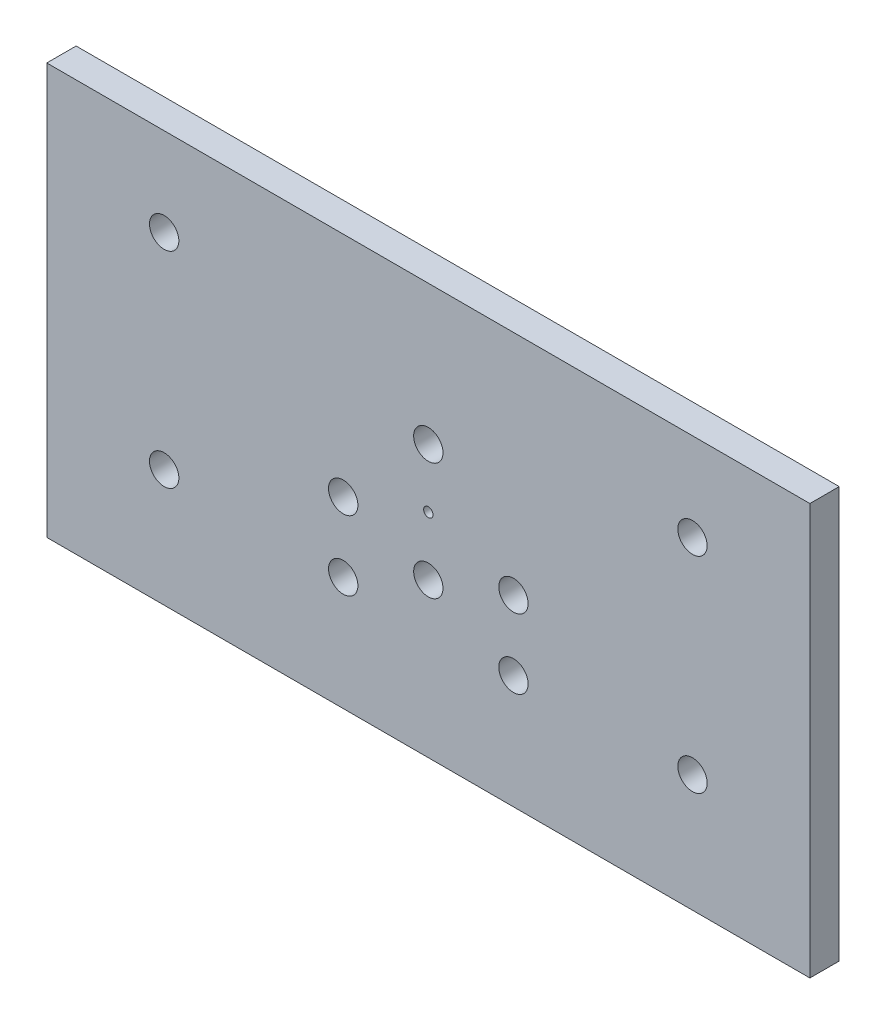
ISO-10303-21;
HEADER;
FILE_DESCRIPTION(('STEP AP214'),'2;1');
FILE_NAME('part.step','',(''),(''),'','','');
FILE_SCHEMA(('AUTOMOTIVE_DESIGN { 1 0 10303 214 1 1 1 1 }'));
ENDSEC;
DATA;
#1=APPLICATION_CONTEXT('core data for automotive mechanical design processes');
#2=APPLICATION_PROTOCOL_DEFINITION('international standard','automotive_design',2000,#1);
#3=PRODUCT_CONTEXT('',#1,'mechanical');
#4=PRODUCT('Part','Part','',(#3));
#5=PRODUCT_RELATED_PRODUCT_CATEGORY('part','',(#4));
#6=PRODUCT_DEFINITION_FORMATION('','',#4);
#7=PRODUCT_DEFINITION_CONTEXT('part definition',#1,'design');
#8=PRODUCT_DEFINITION('design','',#6,#7);
#9=PRODUCT_DEFINITION_SHAPE('','',#8);
#10=(LENGTH_UNIT() NAMED_UNIT(*) SI_UNIT(.MILLI.,.METRE.));
#11=(NAMED_UNIT(*) PLANE_ANGLE_UNIT() SI_UNIT($,.RADIAN.));
#12=(NAMED_UNIT(*) SI_UNIT($,.STERADIAN.) SOLID_ANGLE_UNIT());
#13=UNCERTAINTY_MEASURE_WITH_UNIT(LENGTH_MEASURE(1.E-05),#10,'distance_accuracy_value','');
#14=(GEOMETRIC_REPRESENTATION_CONTEXT(3) GLOBAL_UNCERTAINTY_ASSIGNED_CONTEXT((#13)) GLOBAL_UNIT_ASSIGNED_CONTEXT((#10,
#11,#12)) REPRESENTATION_CONTEXT('',''));
#15=CARTESIAN_POINT('',(0.,0.,0.));
#16=DIRECTION('',(0.,0.,1.));
#17=DIRECTION('',(1.,0.,0.));
#18=AXIS2_PLACEMENT_3D('',#15,#16,#17);
#19=CARTESIAN_POINT('',(0.,0.,5.));
#20=DIRECTION('',(0.,0.,-1.));
#21=DIRECTION('',(-1.,0.,0.));
#22=AXIS2_PLACEMENT_3D('',#19,#20,#21);
#23=PLANE('',#22);
#24=CARTESIAN_POINT('',(65.,26.23,5.));
#25=DIRECTION('',(0.,0.,1.));
#26=DIRECTION('',(1.,0.,0.));
#27=AXIS2_PLACEMENT_3D('',#24,#25,#26);
#28=CIRCLE('',#27,2.5);
#29=CARTESIAN_POINT('',(67.5,26.23,5.));
#30=VERTEX_POINT('',#29);
#31=EDGE_CURVE('E112',#30,#30,#28,.T.);
#32=ORIENTED_EDGE('',*,*,#31,.F.);
#33=EDGE_LOOP('',(#32));
#34=FACE_BOUND('',#33,.T.);
#35=CARTESIAN_POINT('',(65.,46.23,5.));
#36=DIRECTION('',(0.,0.,1.));
#37=DIRECTION('',(1.,0.,0.));
#38=AXIS2_PLACEMENT_3D('',#35,#36,#37);
#39=CIRCLE('',#38,2.5);
#40=CARTESIAN_POINT('',(67.5,46.23,5.));
#41=VERTEX_POINT('',#40);
#42=EDGE_CURVE('E274',#41,#41,#39,.T.);
#43=ORIENTED_EDGE('',*,*,#42,.F.);
#44=EDGE_LOOP('',(#43));
#45=FACE_BOUND('',#44,.T.);
#46=CARTESIAN_POINT('',(65.,36.23,5.));
#47=DIRECTION('',(0.,0.,1.));
#48=DIRECTION('',(1.,0.,0.));
#49=AXIS2_PLACEMENT_3D('',#46,#47,#48);
#50=CIRCLE('',#49,0.799999999999996);
#51=CARTESIAN_POINT('',(65.8,36.23,5.));
#52=VERTEX_POINT('',#51);
#53=EDGE_CURVE('E277',#52,#52,#50,.T.);
#54=ORIENTED_EDGE('',*,*,#53,.F.);
#55=EDGE_LOOP('',(#54));
#56=FACE_BOUND('',#55,.T.);
#57=DIRECTION('',(0.,-1.,0.));
#58=VECTOR('',#57,1.);
#59=CARTESIAN_POINT('',(0.,0.,5.));
#60=LINE('',#59,#58);
#61=CARTESIAN_POINT('',(0.,70.,5.));
#62=VERTEX_POINT('',#61);
#63=CARTESIAN_POINT('',(0.,0.,5.));
#64=VERTEX_POINT('',#63);
#65=EDGE_CURVE('E87',#62,#64,#60,.T.);
#66=ORIENTED_EDGE('',*,*,#65,.T.);
#67=DIRECTION('',(1.,0.,0.));
#68=VECTOR('',#67,1.);
#69=CARTESIAN_POINT('',(0.,0.,5.));
#70=LINE('',#69,#68);
#71=CARTESIAN_POINT('',(130.,0.,5.));
#72=VERTEX_POINT('',#71);
#73=EDGE_CURVE('E82',#64,#72,#70,.T.);
#74=ORIENTED_EDGE('',*,*,#73,.T.);
#75=DIRECTION('',(0.,1.,0.));
#76=VECTOR('',#75,1.);
#77=CARTESIAN_POINT('',(130.,0.,5.));
#78=LINE('',#77,#76);
#79=CARTESIAN_POINT('',(130.,70.,5.));
#80=VERTEX_POINT('',#79);
#81=EDGE_CURVE('E85',#72,#80,#78,.T.);
#82=ORIENTED_EDGE('',*,*,#81,.T.);
#83=DIRECTION('',(-1.,0.,0.));
#84=VECTOR('',#83,1.);
#85=CARTESIAN_POINT('',(0.,70.,5.));
#86=LINE('',#85,#84);
#87=EDGE_CURVE('E52',#80,#62,#86,.T.);
#88=ORIENTED_EDGE('',*,*,#87,.T.);
#89=EDGE_LOOP('',(#66,#74,#82,#88));
#90=FACE_BOUND('',#89,.T.);
#91=CARTESIAN_POINT('',(20.,55.,5.));
#92=DIRECTION('',(0.,0.,1.));
#93=DIRECTION('',(1.,0.,0.));
#94=AXIS2_PLACEMENT_3D('',#91,#92,#93);
#95=CIRCLE('',#94,2.5);
#96=CARTESIAN_POINT('',(22.5,55.,5.));
#97=VERTEX_POINT('',#96);
#98=EDGE_CURVE('E103',#97,#97,#95,.T.);
#99=ORIENTED_EDGE('',*,*,#98,.F.);
#100=EDGE_LOOP('',(#99));
#101=FACE_BOUND('',#100,.T.);
#102=CARTESIAN_POINT('',(110.,55.,5.));
#103=DIRECTION('',(0.,0.,1.));
#104=DIRECTION('',(1.,0.,0.));
#105=AXIS2_PLACEMENT_3D('',#102,#103,#104);
#106=CIRCLE('',#105,2.50000000000001);
#107=CARTESIAN_POINT('',(112.5,55.,5.));
#108=VERTEX_POINT('',#107);
#109=EDGE_CURVE('E160',#108,#108,#106,.T.);
#110=ORIENTED_EDGE('',*,*,#109,.F.);
#111=EDGE_LOOP('',(#110));
#112=FACE_BOUND('',#111,.T.);
#113=CARTESIAN_POINT('',(50.5,31.23,5.));
#114=DIRECTION('',(0.,0.,1.));
#115=DIRECTION('',(1.,0.,0.));
#116=AXIS2_PLACEMENT_3D('',#113,#114,#115);
#117=CIRCLE('',#116,2.5);
#118=CARTESIAN_POINT('',(53.,31.23,5.));
#119=VERTEX_POINT('',#118);
#120=EDGE_CURVE('E154',#119,#119,#117,.T.);
#121=ORIENTED_EDGE('',*,*,#120,.F.);
#122=EDGE_LOOP('',(#121));
#123=FACE_BOUND('',#122,.T.);
#124=CARTESIAN_POINT('',(79.5,31.23,5.));
#125=DIRECTION('',(0.,0.,1.));
#126=DIRECTION('',(1.,0.,0.));
#127=AXIS2_PLACEMENT_3D('',#124,#125,#126);
#128=CIRCLE('',#127,2.50000000000001);
#129=CARTESIAN_POINT('',(82.,31.23,5.));
#130=VERTEX_POINT('',#129);
#131=EDGE_CURVE('E148',#130,#130,#128,.T.);
#132=ORIENTED_EDGE('',*,*,#131,.F.);
#133=EDGE_LOOP('',(#132));
#134=FACE_BOUND('',#133,.T.);
#135=CARTESIAN_POINT('',(50.5,19.37,5.));
#136=DIRECTION('',(0.,0.,1.));
#137=DIRECTION('',(1.,0.,0.));
#138=AXIS2_PLACEMENT_3D('',#135,#136,#137);
#139=CIRCLE('',#138,2.5);
#140=CARTESIAN_POINT('',(53.,19.37,5.));
#141=VERTEX_POINT('',#140);
#142=EDGE_CURVE('E142',#141,#141,#139,.T.);
#143=ORIENTED_EDGE('',*,*,#142,.F.);
#144=EDGE_LOOP('',(#143));
#145=FACE_BOUND('',#144,.T.);
#146=CARTESIAN_POINT('',(79.5,19.37,5.));
#147=DIRECTION('',(0.,0.,1.));
#148=DIRECTION('',(1.,0.,0.));
#149=AXIS2_PLACEMENT_3D('',#146,#147,#148);
#150=CIRCLE('',#149,2.50000000000001);
#151=CARTESIAN_POINT('',(82.,19.37,5.));
#152=VERTEX_POINT('',#151);
#153=EDGE_CURVE('E136',#152,#152,#150,.T.);
#154=ORIENTED_EDGE('',*,*,#153,.F.);
#155=EDGE_LOOP('',(#154));
#156=FACE_BOUND('',#155,.T.);
#157=CARTESIAN_POINT('',(20.,20.,5.));
#158=DIRECTION('',(0.,0.,1.));
#159=DIRECTION('',(1.,0.,0.));
#160=AXIS2_PLACEMENT_3D('',#157,#158,#159);
#161=CIRCLE('',#160,2.5);
#162=CARTESIAN_POINT('',(22.5,20.,5.));
#163=VERTEX_POINT('',#162);
#164=EDGE_CURVE('E130',#163,#163,#161,.T.);
#165=ORIENTED_EDGE('',*,*,#164,.F.);
#166=EDGE_LOOP('',(#165));
#167=FACE_BOUND('',#166,.T.);
#168=CARTESIAN_POINT('',(110.,20.,5.));
#169=DIRECTION('',(0.,0.,1.));
#170=DIRECTION('',(1.,0.,0.));
#171=AXIS2_PLACEMENT_3D('',#168,#169,#170);
#172=CIRCLE('',#171,2.50000000000001);
#173=CARTESIAN_POINT('',(112.5,20.,5.));
#174=VERTEX_POINT('',#173);
#175=EDGE_CURVE('E121',#174,#174,#172,.T.);
#176=ORIENTED_EDGE('',*,*,#175,.F.);
#177=EDGE_LOOP('',(#176));
#178=FACE_BOUND('',#177,.T.);
#179=ADVANCED_FACE('F33',(#34,#45,#56,#90,#101,#112,#123,#134,#145,#156,#167,#178),#23,.F.);
#180=CARTESIAN_POINT('',(0.,0.,0.));
#181=DIRECTION('',(0.,0.,-1.));
#182=DIRECTION('',(-1.,0.,0.));
#183=AXIS2_PLACEMENT_3D('',#180,#181,#182);
#184=PLANE('',#183);
#185=CARTESIAN_POINT('',(65.,26.23,0.));
#186=DIRECTION('',(0.,0.,-1.));
#187=DIRECTION('',(-1.,0.,0.));
#188=AXIS2_PLACEMENT_3D('',#185,#186,#187);
#189=CIRCLE('',#188,2.5);
#190=CARTESIAN_POINT('',(62.5,26.23,0.));
#191=VERTEX_POINT('',#190);
#192=EDGE_CURVE('E37',#191,#191,#189,.T.);
#193=ORIENTED_EDGE('',*,*,#192,.F.);
#194=EDGE_LOOP('',(#193));
#195=FACE_BOUND('',#194,.T.);
#196=CARTESIAN_POINT('',(65.,46.23,0.));
#197=DIRECTION('',(0.,0.,-1.));
#198=DIRECTION('',(-1.,0.,0.));
#199=AXIS2_PLACEMENT_3D('',#196,#197,#198);
#200=CIRCLE('',#199,2.5);
#201=CARTESIAN_POINT('',(62.5,46.23,0.));
#202=VERTEX_POINT('',#201);
#203=EDGE_CURVE('E111',#202,#202,#200,.T.);
#204=ORIENTED_EDGE('',*,*,#203,.F.);
#205=EDGE_LOOP('',(#204));
#206=FACE_BOUND('',#205,.T.);
#207=CARTESIAN_POINT('',(65.,36.23,0.));
#208=DIRECTION('',(0.,0.,-1.));
#209=DIRECTION('',(-1.,0.,0.));
#210=AXIS2_PLACEMENT_3D('',#207,#208,#209);
#211=CIRCLE('',#210,0.799999999999996);
#212=CARTESIAN_POINT('',(64.2,36.23,0.));
#213=VERTEX_POINT('',#212);
#214=EDGE_CURVE('E109',#213,#213,#211,.T.);
#215=ORIENTED_EDGE('',*,*,#214,.F.);
#216=EDGE_LOOP('',(#215));
#217=FACE_BOUND('',#216,.T.);
#218=CARTESIAN_POINT('',(20.,20.,0.));
#219=DIRECTION('',(0.,0.,1.));
#220=DIRECTION('',(1.,0.,0.));
#221=AXIS2_PLACEMENT_3D('',#218,#219,#220);
#222=CIRCLE('',#221,2.5);
#223=CARTESIAN_POINT('',(22.5,20.,0.));
#224=VERTEX_POINT('',#223);
#225=EDGE_CURVE('E126',#224,#224,#222,.T.);
#226=ORIENTED_EDGE('',*,*,#225,.T.);
#227=EDGE_LOOP('',(#226));
#228=FACE_BOUND('',#227,.T.);
#229=CARTESIAN_POINT('',(50.5,19.37,0.));
#230=DIRECTION('',(0.,0.,1.));
#231=DIRECTION('',(1.,0.,0.));
#232=AXIS2_PLACEMENT_3D('',#229,#230,#231);
#233=CIRCLE('',#232,2.5);
#234=CARTESIAN_POINT('',(53.,19.37,0.));
#235=VERTEX_POINT('',#234);
#236=EDGE_CURVE('E139',#235,#235,#233,.T.);
#237=ORIENTED_EDGE('',*,*,#236,.T.);
#238=EDGE_LOOP('',(#237));
#239=FACE_BOUND('',#238,.T.);
#240=CARTESIAN_POINT('',(50.5,31.23,0.));
#241=DIRECTION('',(0.,0.,1.));
#242=DIRECTION('',(1.,0.,0.));
#243=AXIS2_PLACEMENT_3D('',#240,#241,#242);
#244=CIRCLE('',#243,2.5);
#245=CARTESIAN_POINT('',(53.,31.23,0.));
#246=VERTEX_POINT('',#245);
#247=EDGE_CURVE('E151',#246,#246,#244,.T.);
#248=ORIENTED_EDGE('',*,*,#247,.T.);
#249=EDGE_LOOP('',(#248));
#250=FACE_BOUND('',#249,.T.);
#251=CARTESIAN_POINT('',(20.,55.,0.));
#252=DIRECTION('',(0.,0.,1.));
#253=DIRECTION('',(1.,0.,0.));
#254=AXIS2_PLACEMENT_3D('',#251,#252,#253);
#255=CIRCLE('',#254,2.5);
#256=CARTESIAN_POINT('',(22.5,55.,0.));
#257=VERTEX_POINT('',#256);
#258=EDGE_CURVE('E163',#257,#257,#255,.T.);
#259=ORIENTED_EDGE('',*,*,#258,.T.);
#260=EDGE_LOOP('',(#259));
#261=FACE_BOUND('',#260,.T.);
#262=DIRECTION('',(0.,-1.,0.));
#263=VECTOR('',#262,1.);
#264=CARTESIAN_POINT('',(0.,0.,0.));
#265=LINE('',#264,#263);
#266=CARTESIAN_POINT('',(0.,70.,0.));
#267=VERTEX_POINT('',#266);
#268=CARTESIAN_POINT('',(0.,0.,0.));
#269=VERTEX_POINT('',#268);
#270=EDGE_CURVE('E100',#267,#269,#265,.T.);
#271=ORIENTED_EDGE('',*,*,#270,.F.);
#272=DIRECTION('',(-1.,0.,0.));
#273=VECTOR('',#272,1.);
#274=CARTESIAN_POINT('',(0.,70.,0.));
#275=LINE('',#274,#273);
#276=CARTESIAN_POINT('',(130.,70.,0.));
#277=VERTEX_POINT('',#276);
#278=EDGE_CURVE('E75',#277,#267,#275,.T.);
#279=ORIENTED_EDGE('',*,*,#278,.F.);
#280=DIRECTION('',(0.,1.,0.));
#281=VECTOR('',#280,1.);
#282=CARTESIAN_POINT('',(130.,0.,0.));
#283=LINE('',#282,#281);
#284=CARTESIAN_POINT('',(130.,0.,0.));
#285=VERTEX_POINT('',#284);
#286=EDGE_CURVE('E69',#285,#277,#283,.T.);
#287=ORIENTED_EDGE('',*,*,#286,.F.);
#288=DIRECTION('',(1.,0.,0.));
#289=VECTOR('',#288,1.);
#290=CARTESIAN_POINT('',(0.,0.,0.));
#291=LINE('',#290,#289);
#292=EDGE_CURVE('E91',#269,#285,#291,.T.);
#293=ORIENTED_EDGE('',*,*,#292,.F.);
#294=EDGE_LOOP('',(#271,#279,#287,#293));
#295=FACE_BOUND('',#294,.T.);
#296=CARTESIAN_POINT('',(110.,55.,0.));
#297=DIRECTION('',(0.,0.,1.));
#298=DIRECTION('',(1.,0.,0.));
#299=AXIS2_PLACEMENT_3D('',#296,#297,#298);
#300=CIRCLE('',#299,2.50000000000001);
#301=CARTESIAN_POINT('',(112.5,55.,0.));
#302=VERTEX_POINT('',#301);
#303=EDGE_CURVE('E157',#302,#302,#300,.T.);
#304=ORIENTED_EDGE('',*,*,#303,.T.);
#305=EDGE_LOOP('',(#304));
#306=FACE_BOUND('',#305,.T.);
#307=CARTESIAN_POINT('',(79.5,31.23,0.));
#308=DIRECTION('',(0.,0.,1.));
#309=DIRECTION('',(1.,0.,0.));
#310=AXIS2_PLACEMENT_3D('',#307,#308,#309);
#311=CIRCLE('',#310,2.50000000000001);
#312=CARTESIAN_POINT('',(82.,31.23,0.));
#313=VERTEX_POINT('',#312);
#314=EDGE_CURVE('E145',#313,#313,#311,.T.);
#315=ORIENTED_EDGE('',*,*,#314,.T.);
#316=EDGE_LOOP('',(#315));
#317=FACE_BOUND('',#316,.T.);
#318=CARTESIAN_POINT('',(79.5,19.37,0.));
#319=DIRECTION('',(0.,0.,1.));
#320=DIRECTION('',(1.,0.,0.));
#321=AXIS2_PLACEMENT_3D('',#318,#319,#320);
#322=CIRCLE('',#321,2.50000000000001);
#323=CARTESIAN_POINT('',(82.,19.37,0.));
#324=VERTEX_POINT('',#323);
#325=EDGE_CURVE('E133',#324,#324,#322,.T.);
#326=ORIENTED_EDGE('',*,*,#325,.T.);
#327=EDGE_LOOP('',(#326));
#328=FACE_BOUND('',#327,.T.);
#329=CARTESIAN_POINT('',(110.,20.,0.));
#330=DIRECTION('',(0.,0.,1.));
#331=DIRECTION('',(1.,0.,0.));
#332=AXIS2_PLACEMENT_3D('',#329,#330,#331);
#333=CIRCLE('',#332,2.50000000000001);
#334=CARTESIAN_POINT('',(112.5,20.,0.));
#335=VERTEX_POINT('',#334);
#336=EDGE_CURVE('E117',#335,#335,#333,.T.);
#337=ORIENTED_EDGE('',*,*,#336,.T.);
#338=EDGE_LOOP('',(#337));
#339=FACE_BOUND('',#338,.T.);
#340=ADVANCED_FACE('F171',(#195,#206,#217,#228,#239,#250,#261,#295,#306,#317,#328,#339),#184,.T.);
#341=CARTESIAN_POINT('',(0.,0.,5.));
#342=DIRECTION('',(1.,0.,0.));
#343=DIRECTION('',(0.,0.,-1.));
#344=AXIS2_PLACEMENT_3D('',#341,#342,#343);
#345=PLANE('',#344);
#346=ORIENTED_EDGE('',*,*,#270,.T.);
#347=DIRECTION('',(0.,0.,-1.));
#348=VECTOR('',#347,1.);
#349=CARTESIAN_POINT('',(0.,0.,5.));
#350=LINE('',#349,#348);
#351=EDGE_CURVE('E11',#64,#269,#350,.T.);
#352=ORIENTED_EDGE('',*,*,#351,.F.);
#353=ORIENTED_EDGE('',*,*,#65,.F.);
#354=DIRECTION('',(0.,0.,-1.));
#355=VECTOR('',#354,1.);
#356=CARTESIAN_POINT('',(0.,70.,5.));
#357=LINE('',#356,#355);
#358=EDGE_CURVE('E96',#62,#267,#357,.T.);
#359=ORIENTED_EDGE('',*,*,#358,.T.);
#360=EDGE_LOOP('',(#346,#352,#353,#359));
#361=FACE_BOUND('',#360,.T.);
#362=ADVANCED_FACE('F35',(#361),#345,.F.);
#363=CARTESIAN_POINT('',(0.,0.,5.));
#364=DIRECTION('',(0.,1.,0.));
#365=DIRECTION('',(0.,0.,1.));
#366=AXIS2_PLACEMENT_3D('',#363,#364,#365);
#367=PLANE('',#366);
#368=ORIENTED_EDGE('',*,*,#292,.T.);
#369=DIRECTION('',(0.,0.,-1.));
#370=VECTOR('',#369,1.);
#371=CARTESIAN_POINT('',(130.,0.,5.));
#372=LINE('',#371,#370);
#373=EDGE_CURVE('E43',#72,#285,#372,.T.);
#374=ORIENTED_EDGE('',*,*,#373,.F.);
#375=ORIENTED_EDGE('',*,*,#73,.F.);
#376=ORIENTED_EDGE('',*,*,#351,.T.);
#377=EDGE_LOOP('',(#368,#374,#375,#376));
#378=FACE_BOUND('',#377,.T.);
#379=ADVANCED_FACE('F90',(#378),#367,.F.);
#380=CARTESIAN_POINT('',(130.,0.,5.));
#381=DIRECTION('',(-1.,0.,0.));
#382=DIRECTION('',(0.,0.,1.));
#383=AXIS2_PLACEMENT_3D('',#380,#381,#382);
#384=PLANE('',#383);
#385=ORIENTED_EDGE('',*,*,#286,.T.);
#386=DIRECTION('',(0.,0.,-1.));
#387=VECTOR('',#386,1.);
#388=CARTESIAN_POINT('',(130.,70.,5.));
#389=LINE('',#388,#387);
#390=EDGE_CURVE('E92',#80,#277,#389,.T.);
#391=ORIENTED_EDGE('',*,*,#390,.F.);
#392=ORIENTED_EDGE('',*,*,#81,.F.);
#393=ORIENTED_EDGE('',*,*,#373,.T.);
#394=EDGE_LOOP('',(#385,#391,#392,#393));
#395=FACE_BOUND('',#394,.T.);
#396=ADVANCED_FACE('F94',(#395),#384,.F.);
#397=CARTESIAN_POINT('',(0.,70.,5.));
#398=DIRECTION('',(0.,-1.,0.));
#399=DIRECTION('',(0.,0.,-1.));
#400=AXIS2_PLACEMENT_3D('',#397,#398,#399);
#401=PLANE('',#400);
#402=ORIENTED_EDGE('',*,*,#278,.T.);
#403=ORIENTED_EDGE('',*,*,#358,.F.);
#404=ORIENTED_EDGE('',*,*,#87,.F.);
#405=ORIENTED_EDGE('',*,*,#390,.T.);
#406=EDGE_LOOP('',(#402,#403,#404,#405));
#407=FACE_BOUND('',#406,.T.);
#408=ADVANCED_FACE('F177',(#407),#401,.F.);
#409=CARTESIAN_POINT('',(20.,55.,5.));
#410=DIRECTION('',(0.,0.,-1.));
#411=DIRECTION('',(-1.,0.,0.));
#412=AXIS2_PLACEMENT_3D('',#409,#410,#411);
#413=CYLINDRICAL_SURFACE('',#412,2.5);
#414=ORIENTED_EDGE('',*,*,#98,.T.);
#415=EDGE_LOOP('',(#414));
#416=FACE_BOUND('',#415,.T.);
#417=ORIENTED_EDGE('',*,*,#258,.F.);
#418=EDGE_LOOP('',(#417));
#419=FACE_BOUND('',#418,.T.);
#420=ADVANCED_FACE('F174',(#416,#419),#413,.F.);
#421=CARTESIAN_POINT('',(110.,55.,5.));
#422=DIRECTION('',(0.,0.,-1.));
#423=DIRECTION('',(-1.,0.,0.));
#424=AXIS2_PLACEMENT_3D('',#421,#422,#423);
#425=CYLINDRICAL_SURFACE('',#424,2.50000000000001);
#426=ORIENTED_EDGE('',*,*,#109,.T.);
#427=EDGE_LOOP('',(#426));
#428=FACE_BOUND('',#427,.T.);
#429=ORIENTED_EDGE('',*,*,#303,.F.);
#430=EDGE_LOOP('',(#429));
#431=FACE_BOUND('',#430,.T.);
#432=ADVANCED_FACE('F176',(#428,#431),#425,.F.);
#433=CARTESIAN_POINT('',(50.5,31.23,5.));
#434=DIRECTION('',(0.,0.,-1.));
#435=DIRECTION('',(-1.,0.,0.));
#436=AXIS2_PLACEMENT_3D('',#433,#434,#435);
#437=CYLINDRICAL_SURFACE('',#436,2.5);
#438=ORIENTED_EDGE('',*,*,#120,.T.);
#439=EDGE_LOOP('',(#438));
#440=FACE_BOUND('',#439,.T.);
#441=ORIENTED_EDGE('',*,*,#247,.F.);
#442=EDGE_LOOP('',(#441));
#443=FACE_BOUND('',#442,.T.);
#444=ADVANCED_FACE('F184',(#440,#443),#437,.F.);
#445=CARTESIAN_POINT('',(79.5,31.23,5.));
#446=DIRECTION('',(0.,0.,-1.));
#447=DIRECTION('',(-1.,0.,0.));
#448=AXIS2_PLACEMENT_3D('',#445,#446,#447);
#449=CYLINDRICAL_SURFACE('',#448,2.50000000000001);
#450=ORIENTED_EDGE('',*,*,#131,.T.);
#451=EDGE_LOOP('',(#450));
#452=FACE_BOUND('',#451,.T.);
#453=ORIENTED_EDGE('',*,*,#314,.F.);
#454=EDGE_LOOP('',(#453));
#455=FACE_BOUND('',#454,.T.);
#456=ADVANCED_FACE('F228',(#452,#455),#449,.F.);
#457=CARTESIAN_POINT('',(50.5,19.37,5.));
#458=DIRECTION('',(0.,0.,-1.));
#459=DIRECTION('',(-1.,0.,0.));
#460=AXIS2_PLACEMENT_3D('',#457,#458,#459);
#461=CYLINDRICAL_SURFACE('',#460,2.5);
#462=ORIENTED_EDGE('',*,*,#142,.T.);
#463=EDGE_LOOP('',(#462));
#464=FACE_BOUND('',#463,.T.);
#465=ORIENTED_EDGE('',*,*,#236,.F.);
#466=EDGE_LOOP('',(#465));
#467=FACE_BOUND('',#466,.T.);
#468=ADVANCED_FACE('F218',(#464,#467),#461,.F.);
#469=CARTESIAN_POINT('',(79.5,19.37,5.));
#470=DIRECTION('',(0.,0.,-1.));
#471=DIRECTION('',(-1.,0.,0.));
#472=AXIS2_PLACEMENT_3D('',#469,#470,#471);
#473=CYLINDRICAL_SURFACE('',#472,2.50000000000001);
#474=ORIENTED_EDGE('',*,*,#153,.T.);
#475=EDGE_LOOP('',(#474));
#476=FACE_BOUND('',#475,.T.);
#477=ORIENTED_EDGE('',*,*,#325,.F.);
#478=EDGE_LOOP('',(#477));
#479=FACE_BOUND('',#478,.T.);
#480=ADVANCED_FACE('F215',(#476,#479),#473,.F.);
#481=CARTESIAN_POINT('',(20.,20.,5.));
#482=DIRECTION('',(0.,0.,-1.));
#483=DIRECTION('',(-1.,0.,0.));
#484=AXIS2_PLACEMENT_3D('',#481,#482,#483);
#485=CYLINDRICAL_SURFACE('',#484,2.5);
#486=ORIENTED_EDGE('',*,*,#164,.T.);
#487=EDGE_LOOP('',(#486));
#488=FACE_BOUND('',#487,.T.);
#489=ORIENTED_EDGE('',*,*,#225,.F.);
#490=EDGE_LOOP('',(#489));
#491=FACE_BOUND('',#490,.T.);
#492=ADVANCED_FACE('F217',(#488,#491),#485,.F.);
#493=CARTESIAN_POINT('',(110.,20.,5.));
#494=DIRECTION('',(0.,0.,-1.));
#495=DIRECTION('',(-1.,0.,0.));
#496=AXIS2_PLACEMENT_3D('',#493,#494,#495);
#497=CYLINDRICAL_SURFACE('',#496,2.50000000000001);
#498=ORIENTED_EDGE('',*,*,#175,.T.);
#499=EDGE_LOOP('',(#498));
#500=FACE_BOUND('',#499,.T.);
#501=ORIENTED_EDGE('',*,*,#336,.F.);
#502=EDGE_LOOP('',(#501));
#503=FACE_BOUND('',#502,.T.);
#504=ADVANCED_FACE('F225',(#500,#503),#497,.F.);
#505=CARTESIAN_POINT('',(65.,36.23,-5.));
#506=DIRECTION('',(0.,0.,1.));
#507=DIRECTION('',(1.,0.,0.));
#508=AXIS2_PLACEMENT_3D('',#505,#506,#507);
#509=CYLINDRICAL_SURFACE('',#508,0.799999999999996);
#510=ORIENTED_EDGE('',*,*,#214,.T.);
#511=EDGE_LOOP('',(#510));
#512=FACE_BOUND('',#511,.T.);
#513=ORIENTED_EDGE('',*,*,#53,.T.);
#514=EDGE_LOOP('',(#513));
#515=FACE_BOUND('',#514,.T.);
#516=ADVANCED_FACE('F258',(#512,#515),#509,.F.);
#517=CARTESIAN_POINT('',(65.,46.23,-5.));
#518=DIRECTION('',(0.,0.,1.));
#519=DIRECTION('',(1.,0.,0.));
#520=AXIS2_PLACEMENT_3D('',#517,#518,#519);
#521=CYLINDRICAL_SURFACE('',#520,2.5);
#522=ORIENTED_EDGE('',*,*,#203,.T.);
#523=EDGE_LOOP('',(#522));
#524=FACE_BOUND('',#523,.T.);
#525=ORIENTED_EDGE('',*,*,#42,.T.);
#526=EDGE_LOOP('',(#525));
#527=FACE_BOUND('',#526,.T.);
#528=ADVANCED_FACE('F262',(#524,#527),#521,.F.);
#529=CARTESIAN_POINT('',(65.,26.23,-5.));
#530=DIRECTION('',(0.,0.,1.));
#531=DIRECTION('',(1.,0.,0.));
#532=AXIS2_PLACEMENT_3D('',#529,#530,#531);
#533=CYLINDRICAL_SURFACE('',#532,2.5);
#534=ORIENTED_EDGE('',*,*,#192,.T.);
#535=EDGE_LOOP('',(#534));
#536=FACE_BOUND('',#535,.T.);
#537=ORIENTED_EDGE('',*,*,#31,.T.);
#538=EDGE_LOOP('',(#537));
#539=FACE_BOUND('',#538,.T.);
#540=ADVANCED_FACE('F268',(#536,#539),#533,.F.);
#541=CLOSED_SHELL('',(#179,#340,#362,#379,#396,#408,#420,#432,#444,#456,#468,#480,#492,#504,
#516,#528,#540));
#542=MANIFOLD_SOLID_BREP('B2',#541);
#543=ADVANCED_BREP_SHAPE_REPRESENTATION('',(#18,#542),#14);
#544=SHAPE_DEFINITION_REPRESENTATION(#9,#543);
ENDSEC;
END-ISO-10303-21;
